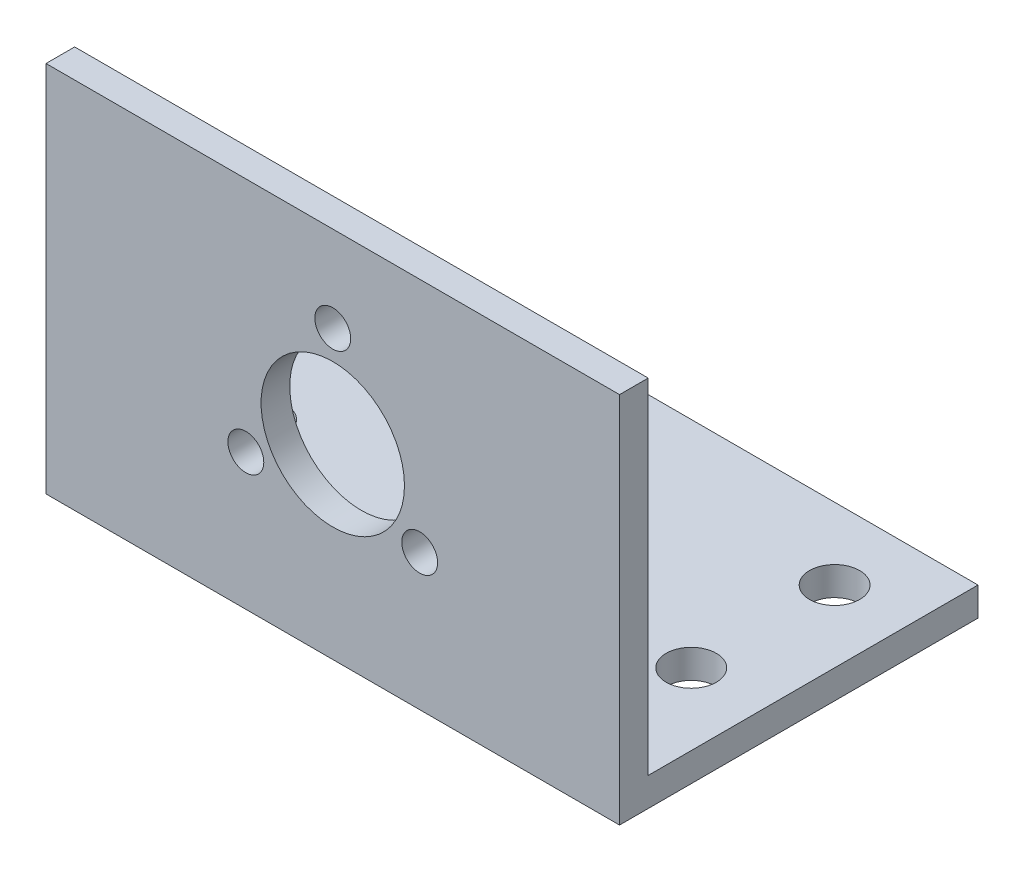
ISO-10303-21;
HEADER;
FILE_DESCRIPTION(('STEP AP214'),'2;1');
FILE_NAME('part.step','',(''),(''),'','','');
FILE_SCHEMA(('AUTOMOTIVE_DESIGN { 1 0 10303 214 1 1 1 1 }'));
ENDSEC;
DATA;
#1=APPLICATION_CONTEXT('core data for automotive mechanical design processes');
#2=APPLICATION_PROTOCOL_DEFINITION('international standard','automotive_design',2000,#1);
#3=PRODUCT_CONTEXT('',#1,'mechanical');
#4=PRODUCT('Part','Part','',(#3));
#5=PRODUCT_RELATED_PRODUCT_CATEGORY('part','',(#4));
#6=PRODUCT_DEFINITION_FORMATION('','',#4);
#7=PRODUCT_DEFINITION_CONTEXT('part definition',#1,'design');
#8=PRODUCT_DEFINITION('design','',#6,#7);
#9=PRODUCT_DEFINITION_SHAPE('','',#8);
#10=(LENGTH_UNIT() NAMED_UNIT(*) SI_UNIT(.MILLI.,.METRE.));
#11=(NAMED_UNIT(*) PLANE_ANGLE_UNIT() SI_UNIT($,.RADIAN.));
#12=(NAMED_UNIT(*) SI_UNIT($,.STERADIAN.) SOLID_ANGLE_UNIT());
#13=UNCERTAINTY_MEASURE_WITH_UNIT(LENGTH_MEASURE(1.E-05),#10,'distance_accuracy_value','');
#14=(GEOMETRIC_REPRESENTATION_CONTEXT(3) GLOBAL_UNCERTAINTY_ASSIGNED_CONTEXT((#13)) GLOBAL_UNIT_ASSIGNED_CONTEXT((#10,
#11,#12)) REPRESENTATION_CONTEXT('',''));
#15=CARTESIAN_POINT('',(0.,0.,0.));
#16=DIRECTION('',(0.,0.,1.));
#17=DIRECTION('',(1.,0.,0.));
#18=AXIS2_PLACEMENT_3D('',#15,#16,#17);
#19=CARTESIAN_POINT('',(0.,2.,0.));
#20=DIRECTION('',(0.,-1.,0.));
#21=DIRECTION('',(0.,0.,-1.));
#22=AXIS2_PLACEMENT_3D('',#19,#20,#21);
#23=PLANE('',#22);
#24=CARTESIAN_POINT('',(-15.,2.,2.5));
#25=DIRECTION('',(0.,-1.,0.));
#26=DIRECTION('',(0.,0.,-1.));
#27=AXIS2_PLACEMENT_3D('',#24,#25,#26);
#28=CIRCLE('',#27,1.75);
#29=CARTESIAN_POINT('',(-15.,2.,0.750000000000002));
#30=VERTEX_POINT('',#29);
#31=EDGE_CURVE('E157',#30,#30,#28,.T.);
#32=ORIENTED_EDGE('',*,*,#31,.T.);
#33=EDGE_LOOP('',(#32));
#34=FACE_BOUND('',#33,.T.);
#35=CARTESIAN_POINT('',(15.,2.,2.5));
#36=DIRECTION('',(0.,-1.,0.));
#37=DIRECTION('',(0.,0.,-1.));
#38=AXIS2_PLACEMENT_3D('',#35,#36,#37);
#39=CIRCLE('',#38,1.75);
#40=CARTESIAN_POINT('',(15.,2.,0.750000000000001));
#41=VERTEX_POINT('',#40);
#42=EDGE_CURVE('E152',#41,#41,#39,.T.);
#43=ORIENTED_EDGE('',*,*,#42,.T.);
#44=EDGE_LOOP('',(#43));
#45=FACE_BOUND('',#44,.T.);
#46=CARTESIAN_POINT('',(-15.,2.,-7.5));
#47=DIRECTION('',(0.,-1.,0.));
#48=DIRECTION('',(0.,0.,-1.));
#49=AXIS2_PLACEMENT_3D('',#46,#47,#48);
#50=CIRCLE('',#49,1.75);
#51=CARTESIAN_POINT('',(-15.,2.,-9.25));
#52=VERTEX_POINT('',#51);
#53=EDGE_CURVE('E169',#52,#52,#50,.T.);
#54=ORIENTED_EDGE('',*,*,#53,.T.);
#55=EDGE_LOOP('',(#54));
#56=FACE_BOUND('',#55,.T.);
#57=CARTESIAN_POINT('',(15.,2.,-7.5));
#58=DIRECTION('',(0.,-1.,0.));
#59=DIRECTION('',(0.,0.,-1.));
#60=AXIS2_PLACEMENT_3D('',#57,#58,#59);
#61=CIRCLE('',#60,1.75);
#62=CARTESIAN_POINT('',(15.,2.,-9.25));
#63=VERTEX_POINT('',#62);
#64=EDGE_CURVE('E164',#63,#63,#61,.T.);
#65=ORIENTED_EDGE('',*,*,#64,.T.);
#66=EDGE_LOOP('',(#65));
#67=FACE_BOUND('',#66,.T.);
#68=DIRECTION('',(-1.,0.,0.));
#69=VECTOR('',#68,1.);
#70=CARTESIAN_POINT('',(-20.,2.,10.5));
#71=LINE('',#70,#69);
#72=CARTESIAN_POINT('',(20.,2.,10.5));
#73=VERTEX_POINT('',#72);
#74=CARTESIAN_POINT('',(-20.,2.,10.5));
#75=VERTEX_POINT('',#74);
#76=EDGE_CURVE('E57',#73,#75,#71,.T.);
#77=ORIENTED_EDGE('',*,*,#76,.F.);
#78=DIRECTION('',(0.,0.,-1.));
#79=VECTOR('',#78,1.);
#80=CARTESIAN_POINT('',(20.,2.,12.5));
#81=LINE('',#80,#79);
#82=CARTESIAN_POINT('',(20.,2.,-12.5));
#83=VERTEX_POINT('',#82);
#84=EDGE_CURVE('E95',#73,#83,#81,.T.);
#85=ORIENTED_EDGE('',*,*,#84,.T.);
#86=DIRECTION('',(-1.,0.,0.));
#87=VECTOR('',#86,1.);
#88=CARTESIAN_POINT('',(-20.,2.,-12.5));
#89=LINE('',#88,#87);
#90=CARTESIAN_POINT('',(-20.,2.,-12.5));
#91=VERTEX_POINT('',#90);
#92=EDGE_CURVE('E63',#83,#91,#89,.T.);
#93=ORIENTED_EDGE('',*,*,#92,.T.);
#94=DIRECTION('',(0.,0.,1.));
#95=VECTOR('',#94,1.);
#96=CARTESIAN_POINT('',(-20.,2.,12.5));
#97=LINE('',#96,#95);
#98=EDGE_CURVE('E106',#91,#75,#97,.T.);
#99=ORIENTED_EDGE('',*,*,#98,.T.);
#100=EDGE_LOOP('',(#77,#85,#93,#99));
#101=FACE_BOUND('',#100,.T.);
#102=ADVANCED_FACE('F40',(#34,#45,#56,#67,#101),#23,.F.);
#103=CARTESIAN_POINT('',(20.,2.,12.5));
#104=DIRECTION('',(-1.,0.,0.));
#105=DIRECTION('',(0.,0.,1.));
#106=AXIS2_PLACEMENT_3D('',#103,#104,#105);
#107=PLANE('',#106);
#108=DIRECTION('',(0.,0.,-1.));
#109=VECTOR('',#108,1.);
#110=CARTESIAN_POINT('',(20.,0.,12.5));
#111=LINE('',#110,#109);
#112=CARTESIAN_POINT('',(20.,0.,12.5));
#113=VERTEX_POINT('',#112);
#114=CARTESIAN_POINT('',(20.,0.,-12.5));
#115=VERTEX_POINT('',#114);
#116=EDGE_CURVE('E102',#113,#115,#111,.T.);
#117=ORIENTED_EDGE('',*,*,#116,.T.);
#118=DIRECTION('',(0.,-1.,0.));
#119=VECTOR('',#118,1.);
#120=CARTESIAN_POINT('',(20.,2.,-12.5));
#121=LINE('',#120,#119);
#122=EDGE_CURVE('E11',#83,#115,#121,.T.);
#123=ORIENTED_EDGE('',*,*,#122,.F.);
#124=ORIENTED_EDGE('',*,*,#84,.F.);
#125=DIRECTION('',(0.,-1.,0.));
#126=VECTOR('',#125,1.);
#127=CARTESIAN_POINT('',(20.,26.,10.5));
#128=LINE('',#127,#126);
#129=CARTESIAN_POINT('',(20.,26.,10.5));
#130=VERTEX_POINT('',#129);
#131=EDGE_CURVE('E110',#130,#73,#128,.T.);
#132=ORIENTED_EDGE('',*,*,#131,.F.);
#133=DIRECTION('',(0.,0.,-1.));
#134=VECTOR('',#133,1.);
#135=CARTESIAN_POINT('',(20.,26.,10.5));
#136=LINE('',#135,#134);
#137=CARTESIAN_POINT('',(20.,26.,12.5));
#138=VERTEX_POINT('',#137);
#139=EDGE_CURVE('E105',#138,#130,#136,.T.);
#140=ORIENTED_EDGE('',*,*,#139,.F.);
#141=DIRECTION('',(0.,-1.,0.));
#142=VECTOR('',#141,1.);
#143=CARTESIAN_POINT('',(20.,2.,12.5));
#144=LINE('',#143,#142);
#145=EDGE_CURVE('E88',#138,#113,#144,.T.);
#146=ORIENTED_EDGE('',*,*,#145,.T.);
#147=EDGE_LOOP('',(#117,#123,#124,#132,#140,#146));
#148=FACE_BOUND('',#147,.T.);
#149=ADVANCED_FACE('F42',(#148),#107,.F.);
#150=CARTESIAN_POINT('',(-20.,2.,-12.5));
#151=DIRECTION('',(0.,0.,1.));
#152=DIRECTION('',(1.,0.,0.));
#153=AXIS2_PLACEMENT_3D('',#150,#151,#152);
#154=PLANE('',#153);
#155=DIRECTION('',(-1.,0.,0.));
#156=VECTOR('',#155,1.);
#157=CARTESIAN_POINT('',(-20.,0.,-12.5));
#158=LINE('',#157,#156);
#159=CARTESIAN_POINT('',(-20.,0.,-12.5));
#160=VERTEX_POINT('',#159);
#161=EDGE_CURVE('E109',#115,#160,#158,.T.);
#162=ORIENTED_EDGE('',*,*,#161,.T.);
#163=DIRECTION('',(0.,-1.,0.));
#164=VECTOR('',#163,1.);
#165=CARTESIAN_POINT('',(-20.,2.,-12.5));
#166=LINE('',#165,#164);
#167=EDGE_CURVE('E49',#91,#160,#166,.T.);
#168=ORIENTED_EDGE('',*,*,#167,.F.);
#169=ORIENTED_EDGE('',*,*,#92,.F.);
#170=ORIENTED_EDGE('',*,*,#122,.T.);
#171=EDGE_LOOP('',(#162,#168,#169,#170));
#172=FACE_BOUND('',#171,.T.);
#173=ADVANCED_FACE('F202',(#172),#154,.F.);
#174=CARTESIAN_POINT('',(-20.,2.,12.5));
#175=DIRECTION('',(1.,0.,0.));
#176=DIRECTION('',(0.,0.,-1.));
#177=AXIS2_PLACEMENT_3D('',#174,#175,#176);
#178=PLANE('',#177);
#179=DIRECTION('',(0.,0.,1.));
#180=VECTOR('',#179,1.);
#181=CARTESIAN_POINT('',(-20.,0.,12.5));
#182=LINE('',#181,#180);
#183=CARTESIAN_POINT('',(-20.,0.,12.5));
#184=VERTEX_POINT('',#183);
#185=EDGE_CURVE('E96',#160,#184,#182,.T.);
#186=ORIENTED_EDGE('',*,*,#185,.T.);
#187=DIRECTION('',(0.,-1.,0.));
#188=VECTOR('',#187,1.);
#189=CARTESIAN_POINT('',(-20.,2.,12.5));
#190=LINE('',#189,#188);
#191=CARTESIAN_POINT('',(-20.,26.,12.5));
#192=VERTEX_POINT('',#191);
#193=EDGE_CURVE('E91',#192,#184,#190,.T.);
#194=ORIENTED_EDGE('',*,*,#193,.F.);
#195=DIRECTION('',(0.,0.,1.));
#196=VECTOR('',#195,1.);
#197=CARTESIAN_POINT('',(-20.,26.,10.5));
#198=LINE('',#197,#196);
#199=CARTESIAN_POINT('',(-20.,26.,10.5));
#200=VERTEX_POINT('',#199);
#201=EDGE_CURVE('E172',#200,#192,#198,.T.);
#202=ORIENTED_EDGE('',*,*,#201,.F.);
#203=DIRECTION('',(0.,-1.,0.));
#204=VECTOR('',#203,1.);
#205=CARTESIAN_POINT('',(-20.,26.,10.5));
#206=LINE('',#205,#204);
#207=EDGE_CURVE('E114',#200,#75,#206,.T.);
#208=ORIENTED_EDGE('',*,*,#207,.T.);
#209=ORIENTED_EDGE('',*,*,#98,.F.);
#210=ORIENTED_EDGE('',*,*,#167,.T.);
#211=EDGE_LOOP('',(#186,#194,#202,#208,#209,#210));
#212=FACE_BOUND('',#211,.T.);
#213=ADVANCED_FACE('F193',(#212),#178,.F.);
#214=CARTESIAN_POINT('',(-20.,2.,12.5));
#215=DIRECTION('',(0.,0.,-1.));
#216=DIRECTION('',(-1.,0.,0.));
#217=AXIS2_PLACEMENT_3D('',#214,#215,#216);
#218=PLANE('',#217);
#219=CARTESIAN_POINT('',(-6.06217782649105,9.49999999999998,12.5));
#220=DIRECTION('',(0.,0.,1.));
#221=DIRECTION('',(-0.500000000000004,0.866025403784436,0.));
#222=AXIS2_PLACEMENT_3D('',#219,#220,#221);
#223=CIRCLE('',#222,1.25);
#224=CARTESIAN_POINT('',(-6.68717782649106,10.5825317547305,12.5));
#225=VERTEX_POINT('',#224);
#226=EDGE_CURVE('E133',#225,#225,#223,.T.);
#227=ORIENTED_EDGE('',*,*,#226,.F.);
#228=EDGE_LOOP('',(#227));
#229=FACE_BOUND('',#228,.T.);
#230=CARTESIAN_POINT('',(6.06217782649111,9.50000000000006,12.5));
#231=DIRECTION('',(0.,0.,1.));
#232=DIRECTION('',(-0.499999999999992,-0.866025403784443,0.));
#233=AXIS2_PLACEMENT_3D('',#230,#231,#232);
#234=CIRCLE('',#233,1.25);
#235=CARTESIAN_POINT('',(5.43717782649111,8.4174682452695,12.5));
#236=VERTEX_POINT('',#235);
#237=EDGE_CURVE('E138',#236,#236,#234,.T.);
#238=ORIENTED_EDGE('',*,*,#237,.F.);
#239=EDGE_LOOP('',(#238));
#240=FACE_BOUND('',#239,.T.);
#241=CARTESIAN_POINT('',(0.,20.,12.5));
#242=DIRECTION('',(0.,0.,1.));
#243=DIRECTION('',(1.,0.,0.));
#244=AXIS2_PLACEMENT_3D('',#241,#242,#243);
#245=CIRCLE('',#244,1.25);
#246=CARTESIAN_POINT('',(1.25,20.,12.5));
#247=VERTEX_POINT('',#246);
#248=EDGE_CURVE('E130',#247,#247,#245,.T.);
#249=ORIENTED_EDGE('',*,*,#248,.F.);
#250=EDGE_LOOP('',(#249));
#251=FACE_BOUND('',#250,.T.);
#252=CARTESIAN_POINT('',(0.,13.,12.5));
#253=DIRECTION('',(0.,0.,1.));
#254=DIRECTION('',(1.,0.,0.));
#255=AXIS2_PLACEMENT_3D('',#252,#253,#254);
#256=CIRCLE('',#255,5.);
#257=CARTESIAN_POINT('',(5.,13.,12.5));
#258=VERTEX_POINT('',#257);
#259=EDGE_CURVE('E127',#258,#258,#256,.T.);
#260=ORIENTED_EDGE('',*,*,#259,.F.);
#261=EDGE_LOOP('',(#260));
#262=FACE_BOUND('',#261,.T.);
#263=DIRECTION('',(1.,0.,0.));
#264=VECTOR('',#263,1.);
#265=CARTESIAN_POINT('',(-20.,0.,12.5));
#266=LINE('',#265,#264);
#267=EDGE_CURVE('E83',#184,#113,#266,.T.);
#268=ORIENTED_EDGE('',*,*,#267,.T.);
#269=ORIENTED_EDGE('',*,*,#145,.F.);
#270=DIRECTION('',(1.,0.,0.));
#271=VECTOR('',#270,1.);
#272=CARTESIAN_POINT('',(-20.,26.,12.5));
#273=LINE('',#272,#271);
#274=EDGE_CURVE('E175',#192,#138,#273,.T.);
#275=ORIENTED_EDGE('',*,*,#274,.F.);
#276=ORIENTED_EDGE('',*,*,#193,.T.);
#277=EDGE_LOOP('',(#268,#269,#275,#276));
#278=FACE_BOUND('',#277,.T.);
#279=ADVANCED_FACE('F85',(#229,#240,#251,#262,#278),#218,.F.);
#280=CARTESIAN_POINT('',(0.,0.,0.));
#281=DIRECTION('',(0.,-1.,0.));
#282=DIRECTION('',(0.,0.,-1.));
#283=AXIS2_PLACEMENT_3D('',#280,#281,#282);
#284=PLANE('',#283);
#285=CARTESIAN_POINT('',(-15.,0.,2.5));
#286=DIRECTION('',(0.,-1.,0.));
#287=DIRECTION('',(0.,0.,-1.));
#288=AXIS2_PLACEMENT_3D('',#285,#286,#287);
#289=CIRCLE('',#288,1.75);
#290=CARTESIAN_POINT('',(-15.,0.,0.750000000000002));
#291=VERTEX_POINT('',#290);
#292=EDGE_CURVE('E149',#291,#291,#289,.T.);
#293=ORIENTED_EDGE('',*,*,#292,.F.);
#294=EDGE_LOOP('',(#293));
#295=FACE_BOUND('',#294,.T.);
#296=CARTESIAN_POINT('',(15.,0.,2.5));
#297=DIRECTION('',(0.,-1.,0.));
#298=DIRECTION('',(0.,0.,-1.));
#299=AXIS2_PLACEMENT_3D('',#296,#297,#298);
#300=CIRCLE('',#299,1.75);
#301=CARTESIAN_POINT('',(15.,0.,0.750000000000001));
#302=VERTEX_POINT('',#301);
#303=EDGE_CURVE('E126',#302,#302,#300,.T.);
#304=ORIENTED_EDGE('',*,*,#303,.F.);
#305=EDGE_LOOP('',(#304));
#306=FACE_BOUND('',#305,.T.);
#307=CARTESIAN_POINT('',(-15.,0.,-7.5));
#308=DIRECTION('',(0.,-1.,0.));
#309=DIRECTION('',(0.,0.,-1.));
#310=AXIS2_PLACEMENT_3D('',#307,#308,#309);
#311=CIRCLE('',#310,1.75);
#312=CARTESIAN_POINT('',(-15.,0.,-9.25));
#313=VERTEX_POINT('',#312);
#314=EDGE_CURVE('E161',#313,#313,#311,.T.);
#315=ORIENTED_EDGE('',*,*,#314,.F.);
#316=EDGE_LOOP('',(#315));
#317=FACE_BOUND('',#316,.T.);
#318=CARTESIAN_POINT('',(15.,0.,-7.5));
#319=DIRECTION('',(0.,-1.,0.));
#320=DIRECTION('',(0.,0.,-1.));
#321=AXIS2_PLACEMENT_3D('',#318,#319,#320);
#322=CIRCLE('',#321,1.75);
#323=CARTESIAN_POINT('',(15.,0.,-9.25));
#324=VERTEX_POINT('',#323);
#325=EDGE_CURVE('E160',#324,#324,#322,.T.);
#326=ORIENTED_EDGE('',*,*,#325,.F.);
#327=EDGE_LOOP('',(#326));
#328=FACE_BOUND('',#327,.T.);
#329=ORIENTED_EDGE('',*,*,#116,.F.);
#330=ORIENTED_EDGE('',*,*,#267,.F.);
#331=ORIENTED_EDGE('',*,*,#185,.F.);
#332=ORIENTED_EDGE('',*,*,#161,.F.);
#333=EDGE_LOOP('',(#329,#330,#331,#332));
#334=FACE_BOUND('',#333,.T.);
#335=ADVANCED_FACE('F108',(#295,#306,#317,#328,#334),#284,.T.);
#336=CARTESIAN_POINT('',(-20.,26.,10.5));
#337=DIRECTION('',(0.,0.,1.));
#338=DIRECTION('',(1.,0.,0.));
#339=AXIS2_PLACEMENT_3D('',#336,#337,#338);
#340=PLANE('',#339);
#341=CARTESIAN_POINT('',(-6.06217782649105,9.49999999999998,10.5));
#342=DIRECTION('',(0.,0.,1.));
#343=DIRECTION('',(1.,0.,0.));
#344=AXIS2_PLACEMENT_3D('',#341,#342,#343);
#345=CIRCLE('',#344,1.25);
#346=CARTESIAN_POINT('',(-4.81217782649105,9.49999999999998,10.5));
#347=VERTEX_POINT('',#346);
#348=EDGE_CURVE('E44',#347,#347,#345,.T.);
#349=ORIENTED_EDGE('',*,*,#348,.T.);
#350=EDGE_LOOP('',(#349));
#351=FACE_BOUND('',#350,.T.);
#352=CARTESIAN_POINT('',(6.06217782649111,9.50000000000006,10.5));
#353=DIRECTION('',(0.,0.,1.));
#354=DIRECTION('',(1.,0.,0.));
#355=AXIS2_PLACEMENT_3D('',#352,#353,#354);
#356=CIRCLE('',#355,1.25);
#357=CARTESIAN_POINT('',(7.31217782649111,9.50000000000006,10.5));
#358=VERTEX_POINT('',#357);
#359=EDGE_CURVE('E131',#358,#358,#356,.T.);
#360=ORIENTED_EDGE('',*,*,#359,.T.);
#361=EDGE_LOOP('',(#360));
#362=FACE_BOUND('',#361,.T.);
#363=CARTESIAN_POINT('',(0.,20.,10.5));
#364=DIRECTION('',(0.,0.,1.));
#365=DIRECTION('',(1.,0.,0.));
#366=AXIS2_PLACEMENT_3D('',#363,#364,#365);
#367=CIRCLE('',#366,1.25);
#368=CARTESIAN_POINT('',(1.25,20.,10.5));
#369=VERTEX_POINT('',#368);
#370=EDGE_CURVE('E128',#369,#369,#367,.T.);
#371=ORIENTED_EDGE('',*,*,#370,.T.);
#372=EDGE_LOOP('',(#371));
#373=FACE_BOUND('',#372,.T.);
#374=CARTESIAN_POINT('',(0.,13.,10.5));
#375=DIRECTION('',(0.,0.,1.));
#376=DIRECTION('',(1.,0.,0.));
#377=AXIS2_PLACEMENT_3D('',#374,#375,#376);
#378=CIRCLE('',#377,5.);
#379=CARTESIAN_POINT('',(5.,13.,10.5));
#380=VERTEX_POINT('',#379);
#381=EDGE_CURVE('E123',#380,#380,#378,.T.);
#382=ORIENTED_EDGE('',*,*,#381,.T.);
#383=EDGE_LOOP('',(#382));
#384=FACE_BOUND('',#383,.T.);
#385=ORIENTED_EDGE('',*,*,#76,.T.);
#386=ORIENTED_EDGE('',*,*,#207,.F.);
#387=DIRECTION('',(-1.,0.,0.));
#388=VECTOR('',#387,1.);
#389=CARTESIAN_POINT('',(-20.,26.,10.5));
#390=LINE('',#389,#388);
#391=EDGE_CURVE('E178',#130,#200,#390,.T.);
#392=ORIENTED_EDGE('',*,*,#391,.F.);
#393=ORIENTED_EDGE('',*,*,#131,.T.);
#394=EDGE_LOOP('',(#385,#386,#392,#393));
#395=FACE_BOUND('',#394,.T.);
#396=ADVANCED_FACE('F190',(#351,#362,#373,#384,#395),#340,.F.);
#397=CARTESIAN_POINT('',(0.,26.,0.));
#398=DIRECTION('',(0.,1.,0.));
#399=DIRECTION('',(0.,0.,1.));
#400=AXIS2_PLACEMENT_3D('',#397,#398,#399);
#401=PLANE('',#400);
#402=ORIENTED_EDGE('',*,*,#201,.T.);
#403=ORIENTED_EDGE('',*,*,#274,.T.);
#404=ORIENTED_EDGE('',*,*,#139,.T.);
#405=ORIENTED_EDGE('',*,*,#391,.T.);
#406=EDGE_LOOP('',(#402,#403,#404,#405));
#407=FACE_BOUND('',#406,.T.);
#408=ADVANCED_FACE('F197',(#407),#401,.T.);
#409=CARTESIAN_POINT('',(15.,26.,-7.5));
#410=DIRECTION('',(0.,-1.,0.));
#411=DIRECTION('',(0.,0.,-1.));
#412=AXIS2_PLACEMENT_3D('',#409,#410,#411);
#413=CYLINDRICAL_SURFACE('',#412,1.75);
#414=ORIENTED_EDGE('',*,*,#325,.T.);
#415=EDGE_LOOP('',(#414));
#416=FACE_BOUND('',#415,.T.);
#417=ORIENTED_EDGE('',*,*,#64,.F.);
#418=EDGE_LOOP('',(#417));
#419=FACE_BOUND('',#418,.T.);
#420=ADVANCED_FACE('F245',(#416,#419),#413,.F.);
#421=CARTESIAN_POINT('',(-15.,26.,-7.5));
#422=DIRECTION('',(0.,-1.,0.));
#423=DIRECTION('',(0.,0.,-1.));
#424=AXIS2_PLACEMENT_3D('',#421,#422,#423);
#425=CYLINDRICAL_SURFACE('',#424,1.75);
#426=ORIENTED_EDGE('',*,*,#314,.T.);
#427=EDGE_LOOP('',(#426));
#428=FACE_BOUND('',#427,.T.);
#429=ORIENTED_EDGE('',*,*,#53,.F.);
#430=EDGE_LOOP('',(#429));
#431=FACE_BOUND('',#430,.T.);
#432=ADVANCED_FACE('F268',(#428,#431),#425,.F.);
#433=CARTESIAN_POINT('',(15.,26.,2.5));
#434=DIRECTION('',(0.,-1.,0.));
#435=DIRECTION('',(0.,0.,-1.));
#436=AXIS2_PLACEMENT_3D('',#433,#434,#435);
#437=CYLINDRICAL_SURFACE('',#436,1.75);
#438=ORIENTED_EDGE('',*,*,#303,.T.);
#439=EDGE_LOOP('',(#438));
#440=FACE_BOUND('',#439,.T.);
#441=ORIENTED_EDGE('',*,*,#42,.F.);
#442=EDGE_LOOP('',(#441));
#443=FACE_BOUND('',#442,.T.);
#444=ADVANCED_FACE('F264',(#440,#443),#437,.F.);
#445=CARTESIAN_POINT('',(-15.,26.,2.5));
#446=DIRECTION('',(0.,-1.,0.));
#447=DIRECTION('',(0.,0.,-1.));
#448=AXIS2_PLACEMENT_3D('',#445,#446,#447);
#449=CYLINDRICAL_SURFACE('',#448,1.75);
#450=ORIENTED_EDGE('',*,*,#292,.T.);
#451=EDGE_LOOP('',(#450));
#452=FACE_BOUND('',#451,.T.);
#453=ORIENTED_EDGE('',*,*,#31,.F.);
#454=EDGE_LOOP('',(#453));
#455=FACE_BOUND('',#454,.T.);
#456=ADVANCED_FACE('F236',(#452,#455),#449,.F.);
#457=CARTESIAN_POINT('',(0.,13.,-12.5));
#458=DIRECTION('',(0.,0.,1.));
#459=DIRECTION('',(1.,0.,0.));
#460=AXIS2_PLACEMENT_3D('',#457,#458,#459);
#461=CYLINDRICAL_SURFACE('',#460,5.);
#462=ORIENTED_EDGE('',*,*,#259,.T.);
#463=EDGE_LOOP('',(#462));
#464=FACE_BOUND('',#463,.T.);
#465=ORIENTED_EDGE('',*,*,#381,.F.);
#466=EDGE_LOOP('',(#465));
#467=FACE_BOUND('',#466,.T.);
#468=ADVANCED_FACE('F232',(#464,#467),#461,.F.);
#469=CARTESIAN_POINT('',(0.,20.,-12.5));
#470=DIRECTION('',(0.,0.,1.));
#471=DIRECTION('',(1.,0.,0.));
#472=AXIS2_PLACEMENT_3D('',#469,#470,#471);
#473=CYLINDRICAL_SURFACE('',#472,1.25);
#474=ORIENTED_EDGE('',*,*,#248,.T.);
#475=EDGE_LOOP('',(#474));
#476=FACE_BOUND('',#475,.T.);
#477=ORIENTED_EDGE('',*,*,#370,.F.);
#478=EDGE_LOOP('',(#477));
#479=FACE_BOUND('',#478,.T.);
#480=ADVANCED_FACE('F235',(#476,#479),#473,.F.);
#481=CARTESIAN_POINT('',(6.06217782649111,9.50000000000006,-12.5));
#482=DIRECTION('',(0.,0.,1.));
#483=DIRECTION('',(1.,0.,0.));
#484=AXIS2_PLACEMENT_3D('',#481,#482,#483);
#485=CYLINDRICAL_SURFACE('',#484,1.25);
#486=ORIENTED_EDGE('',*,*,#237,.T.);
#487=EDGE_LOOP('',(#486));
#488=FACE_BOUND('',#487,.T.);
#489=ORIENTED_EDGE('',*,*,#359,.F.);
#490=EDGE_LOOP('',(#489));
#491=FACE_BOUND('',#490,.T.);
#492=ADVANCED_FACE('F251',(#488,#491),#485,.F.);
#493=CARTESIAN_POINT('',(-6.06217782649105,9.49999999999998,-12.5));
#494=DIRECTION('',(0.,0.,1.));
#495=DIRECTION('',(1.,0.,0.));
#496=AXIS2_PLACEMENT_3D('',#493,#494,#495);
#497=CYLINDRICAL_SURFACE('',#496,1.25);
#498=ORIENTED_EDGE('',*,*,#226,.T.);
#499=EDGE_LOOP('',(#498));
#500=FACE_BOUND('',#499,.T.);
#501=ORIENTED_EDGE('',*,*,#348,.F.);
#502=EDGE_LOOP('',(#501));
#503=FACE_BOUND('',#502,.T.);
#504=ADVANCED_FACE('F257',(#500,#503),#497,.F.);
#505=CLOSED_SHELL('',(#102,#149,#173,#213,#279,#335,#396,#408,#420,#432,#444,#456,#468,#480,
#492,#504));
#506=MANIFOLD_SOLID_BREP('B2',#505);
#507=ADVANCED_BREP_SHAPE_REPRESENTATION('',(#18,#506),#14);
#508=SHAPE_DEFINITION_REPRESENTATION(#9,#507);
ENDSEC;
END-ISO-10303-21;
